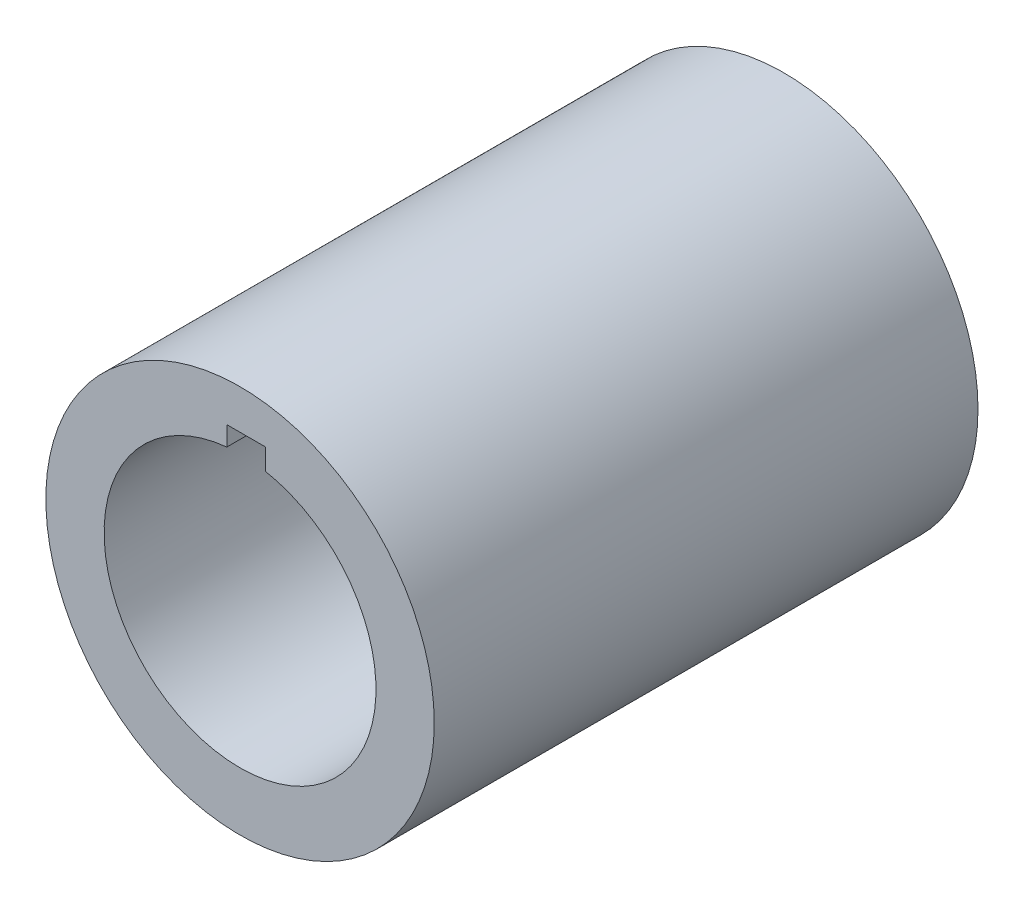
ISO-10303-21;
HEADER;
FILE_DESCRIPTION(('STEP AP214'),'2;1');
FILE_NAME('part.step','',(''),(''),'','','');
FILE_SCHEMA(('AUTOMOTIVE_DESIGN { 1 0 10303 214 1 1 1 1 }'));
ENDSEC;
DATA;
#1=APPLICATION_CONTEXT('core data for automotive mechanical design processes');
#2=APPLICATION_PROTOCOL_DEFINITION('international standard','automotive_design',2000,#1);
#3=PRODUCT_CONTEXT('',#1,'mechanical');
#4=PRODUCT('Part','Part','',(#3));
#5=PRODUCT_RELATED_PRODUCT_CATEGORY('part','',(#4));
#6=PRODUCT_DEFINITION_FORMATION('','',#4);
#7=PRODUCT_DEFINITION_CONTEXT('part definition',#1,'design');
#8=PRODUCT_DEFINITION('design','',#6,#7);
#9=PRODUCT_DEFINITION_SHAPE('','',#8);
#10=(LENGTH_UNIT() NAMED_UNIT(*) SI_UNIT(.MILLI.,.METRE.));
#11=(NAMED_UNIT(*) PLANE_ANGLE_UNIT() SI_UNIT($,.RADIAN.));
#12=(NAMED_UNIT(*) SI_UNIT($,.STERADIAN.) SOLID_ANGLE_UNIT());
#13=UNCERTAINTY_MEASURE_WITH_UNIT(LENGTH_MEASURE(1.E-05),#10,'distance_accuracy_value','');
#14=(GEOMETRIC_REPRESENTATION_CONTEXT(3) GLOBAL_UNCERTAINTY_ASSIGNED_CONTEXT((#13)) GLOBAL_UNIT_ASSIGNED_CONTEXT((#10,
#11,#12)) REPRESENTATION_CONTEXT('',''));
#15=CARTESIAN_POINT('',(0.,0.,0.));
#16=DIRECTION('',(0.,0.,1.));
#17=DIRECTION('',(1.,0.,0.));
#18=AXIS2_PLACEMENT_3D('',#15,#16,#17);
#19=CARTESIAN_POINT('',(0.,0.,14.));
#20=DIRECTION('',(0.,0.,1.));
#21=DIRECTION('',(1.,0.,0.));
#22=AXIS2_PLACEMENT_3D('',#19,#20,#21);
#23=PLANE('',#22);
#24=CARTESIAN_POINT('',(0.,0.,14.));
#25=DIRECTION('',(0.,0.,1.));
#26=DIRECTION('',(1.,0.,0.));
#27=AXIS2_PLACEMENT_3D('',#24,#25,#26);
#28=CIRCLE('',#27,5.);
#29=CARTESIAN_POINT('',(5.,0.,14.));
#30=VERTEX_POINT('',#29);
#31=EDGE_CURVE('E11',#30,#30,#28,.T.);
#32=ORIENTED_EDGE('',*,*,#31,.T.);
#33=EDGE_LOOP('',(#32));
#34=FACE_BOUND('',#33,.T.);
#35=DIRECTION('',(0.,1.,0.));
#36=VECTOR('',#35,1.);
#37=CARTESIAN_POINT('',(0.659161969488209,3.98336467183051,14.));
#38=LINE('',#37,#36);
#39=CARTESIAN_POINT('',(0.659161969488209,3.43736897902748,14.));
#40=VERTEX_POINT('',#39);
#41=CARTESIAN_POINT('',(0.659161969488209,3.98336467183051,14.));
#42=VERTEX_POINT('',#41);
#43=EDGE_CURVE('E90',#40,#42,#38,.T.);
#44=ORIENTED_EDGE('',*,*,#43,.F.);
#45=CARTESIAN_POINT('',(0.,0.,14.));
#46=DIRECTION('',(0.,0.,1.));
#47=DIRECTION('',(1.,0.,0.));
#48=AXIS2_PLACEMENT_3D('',#45,#46,#47);
#49=CIRCLE('',#48,3.5);
#50=CARTESIAN_POINT('',(-0.340838030511792,3.48336467183051,14.));
#51=VERTEX_POINT('',#50);
#52=EDGE_CURVE('E81',#51,#40,#49,.T.);
#53=ORIENTED_EDGE('',*,*,#52,.F.);
#54=DIRECTION('',(0.,-1.,0.));
#55=VECTOR('',#54,1.);
#56=CARTESIAN_POINT('',(-0.340838030511792,3.48336467183051,14.));
#57=LINE('',#56,#55);
#58=CARTESIAN_POINT('',(-0.340838030511792,3.98336467183051,14.));
#59=VERTEX_POINT('',#58);
#60=EDGE_CURVE('E106',#59,#51,#57,.T.);
#61=ORIENTED_EDGE('',*,*,#60,.F.);
#62=DIRECTION('',(-1.,0.,0.));
#63=VECTOR('',#62,1.);
#64=CARTESIAN_POINT('',(-0.340838030511792,3.98336467183051,14.));
#65=LINE('',#64,#63);
#66=EDGE_CURVE('E102',#42,#59,#65,.T.);
#67=ORIENTED_EDGE('',*,*,#66,.F.);
#68=EDGE_LOOP('',(#44,#53,#61,#67));
#69=FACE_BOUND('',#68,.T.);
#70=ADVANCED_FACE('F39',(#34,#69),#23,.T.);
#71=CARTESIAN_POINT('',(0.,0.,0.));
#72=DIRECTION('',(0.,0.,1.));
#73=DIRECTION('',(1.,0.,0.));
#74=AXIS2_PLACEMENT_3D('',#71,#72,#73);
#75=PLANE('',#74);
#76=CARTESIAN_POINT('',(0.,0.,0.));
#77=DIRECTION('',(0.,0.,1.));
#78=DIRECTION('',(1.,0.,0.));
#79=AXIS2_PLACEMENT_3D('',#76,#77,#78);
#80=CIRCLE('',#79,5.);
#81=CARTESIAN_POINT('',(5.,0.,0.));
#82=VERTEX_POINT('',#81);
#83=EDGE_CURVE('E43',#82,#82,#80,.T.);
#84=ORIENTED_EDGE('',*,*,#83,.F.);
#85=EDGE_LOOP('',(#84));
#86=FACE_BOUND('',#85,.T.);
#87=CARTESIAN_POINT('',(0.,0.,0.));
#88=DIRECTION('',(0.,0.,1.));
#89=DIRECTION('',(1.,0.,0.));
#90=AXIS2_PLACEMENT_3D('',#87,#88,#89);
#91=CIRCLE('',#90,3.5);
#92=CARTESIAN_POINT('',(-0.340838030511792,3.48336467183051,0.));
#93=VERTEX_POINT('',#92);
#94=CARTESIAN_POINT('',(0.659161969488209,3.43736897902748,0.));
#95=VERTEX_POINT('',#94);
#96=EDGE_CURVE('E63',#93,#95,#91,.T.);
#97=ORIENTED_EDGE('',*,*,#96,.T.);
#98=DIRECTION('',(0.,1.,0.));
#99=VECTOR('',#98,1.);
#100=CARTESIAN_POINT('',(0.659161969488209,3.98336467183051,0.));
#101=LINE('',#100,#99);
#102=CARTESIAN_POINT('',(0.659161969488209,3.98336467183051,0.));
#103=VERTEX_POINT('',#102);
#104=EDGE_CURVE('E97',#95,#103,#101,.T.);
#105=ORIENTED_EDGE('',*,*,#104,.T.);
#106=DIRECTION('',(-1.,0.,0.));
#107=VECTOR('',#106,1.);
#108=CARTESIAN_POINT('',(-0.340838030511792,3.98336467183051,0.));
#109=LINE('',#108,#107);
#110=CARTESIAN_POINT('',(-0.340838030511792,3.98336467183051,0.));
#111=VERTEX_POINT('',#110);
#112=EDGE_CURVE('E115',#103,#111,#109,.T.);
#113=ORIENTED_EDGE('',*,*,#112,.T.);
#114=DIRECTION('',(0.,-1.,0.));
#115=VECTOR('',#114,1.);
#116=CARTESIAN_POINT('',(-0.340838030511792,3.48336467183051,0.));
#117=LINE('',#116,#115);
#118=EDGE_CURVE('E91',#111,#93,#117,.T.);
#119=ORIENTED_EDGE('',*,*,#118,.T.);
#120=EDGE_LOOP('',(#97,#105,#113,#119));
#121=FACE_BOUND('',#120,.T.);
#122=ADVANCED_FACE('F131',(#86,#121),#75,.F.);
#123=CARTESIAN_POINT('',(0.,0.,14.));
#124=DIRECTION('',(0.,0.,-1.));
#125=DIRECTION('',(-1.,0.,0.));
#126=AXIS2_PLACEMENT_3D('',#123,#124,#125);
#127=CYLINDRICAL_SURFACE('',#126,5.);
#128=ORIENTED_EDGE('',*,*,#31,.F.);
#129=EDGE_LOOP('',(#128));
#130=FACE_BOUND('',#129,.T.);
#131=ORIENTED_EDGE('',*,*,#83,.T.);
#132=EDGE_LOOP('',(#131));
#133=FACE_BOUND('',#132,.T.);
#134=ADVANCED_FACE('F41',(#130,#133),#127,.T.);
#135=CARTESIAN_POINT('',(0.,0.,14.));
#136=DIRECTION('',(0.,0.,-1.));
#137=DIRECTION('',(-1.,0.,0.));
#138=AXIS2_PLACEMENT_3D('',#135,#136,#137);
#139=CYLINDRICAL_SURFACE('',#138,3.5);
#140=ORIENTED_EDGE('',*,*,#96,.F.);
#141=DIRECTION('',(0.,0.,-1.));
#142=VECTOR('',#141,1.);
#143=CARTESIAN_POINT('',(-0.340838030511792,3.48336467183051,14.));
#144=LINE('',#143,#142);
#145=EDGE_CURVE('E85',#51,#93,#144,.T.);
#146=ORIENTED_EDGE('',*,*,#145,.F.);
#147=ORIENTED_EDGE('',*,*,#52,.T.);
#148=DIRECTION('',(0.,0.,-1.));
#149=VECTOR('',#148,1.);
#150=CARTESIAN_POINT('',(0.659161969488209,3.43736897902748,14.));
#151=LINE('',#150,#149);
#152=EDGE_CURVE('E84',#40,#95,#151,.T.);
#153=ORIENTED_EDGE('',*,*,#152,.T.);
#154=EDGE_LOOP('',(#140,#146,#147,#153));
#155=FACE_BOUND('',#154,.T.);
#156=ADVANCED_FACE('F83',(#155),#139,.F.);
#157=CARTESIAN_POINT('',(0.659161969488209,3.98336467183051,14.));
#158=DIRECTION('',(-1.,0.,0.));
#159=DIRECTION('',(0.,0.,1.));
#160=AXIS2_PLACEMENT_3D('',#157,#158,#159);
#161=PLANE('',#160);
#162=ORIENTED_EDGE('',*,*,#104,.F.);
#163=ORIENTED_EDGE('',*,*,#152,.F.);
#164=ORIENTED_EDGE('',*,*,#43,.T.);
#165=DIRECTION('',(0.,0.,-1.));
#166=VECTOR('',#165,1.);
#167=CARTESIAN_POINT('',(0.659161969488209,3.98336467183051,14.));
#168=LINE('',#167,#166);
#169=EDGE_CURVE('E99',#42,#103,#168,.T.);
#170=ORIENTED_EDGE('',*,*,#169,.T.);
#171=EDGE_LOOP('',(#162,#163,#164,#170));
#172=FACE_BOUND('',#171,.T.);
#173=ADVANCED_FACE('F94',(#172),#161,.T.);
#174=CARTESIAN_POINT('',(-0.340838030511792,3.98336467183051,14.));
#175=DIRECTION('',(0.,-1.,0.));
#176=DIRECTION('',(0.,0.,-1.));
#177=AXIS2_PLACEMENT_3D('',#174,#175,#176);
#178=PLANE('',#177);
#179=ORIENTED_EDGE('',*,*,#112,.F.);
#180=ORIENTED_EDGE('',*,*,#169,.F.);
#181=ORIENTED_EDGE('',*,*,#66,.T.);
#182=DIRECTION('',(0.,0.,-1.));
#183=VECTOR('',#182,1.);
#184=CARTESIAN_POINT('',(-0.340838030511792,3.98336467183051,14.));
#185=LINE('',#184,#183);
#186=EDGE_CURVE('E55',#59,#111,#185,.T.);
#187=ORIENTED_EDGE('',*,*,#186,.T.);
#188=EDGE_LOOP('',(#179,#180,#181,#187));
#189=FACE_BOUND('',#188,.T.);
#190=ADVANCED_FACE('F129',(#189),#178,.T.);
#191=CARTESIAN_POINT('',(-0.340838030511792,3.48336467183051,14.));
#192=DIRECTION('',(1.,0.,0.));
#193=DIRECTION('',(0.,0.,-1.));
#194=AXIS2_PLACEMENT_3D('',#191,#192,#193);
#195=PLANE('',#194);
#196=ORIENTED_EDGE('',*,*,#118,.F.);
#197=ORIENTED_EDGE('',*,*,#186,.F.);
#198=ORIENTED_EDGE('',*,*,#60,.T.);
#199=ORIENTED_EDGE('',*,*,#145,.T.);
#200=EDGE_LOOP('',(#196,#197,#198,#199));
#201=FACE_BOUND('',#200,.T.);
#202=ADVANCED_FACE('F132',(#201),#195,.T.);
#203=CLOSED_SHELL('',(#70,#122,#134,#156,#173,#190,#202));
#204=MANIFOLD_SOLID_BREP('B2',#203);
#205=ADVANCED_BREP_SHAPE_REPRESENTATION('',(#18,#204),#14);
#206=SHAPE_DEFINITION_REPRESENTATION(#9,#205);
ENDSEC;
END-ISO-10303-21;
